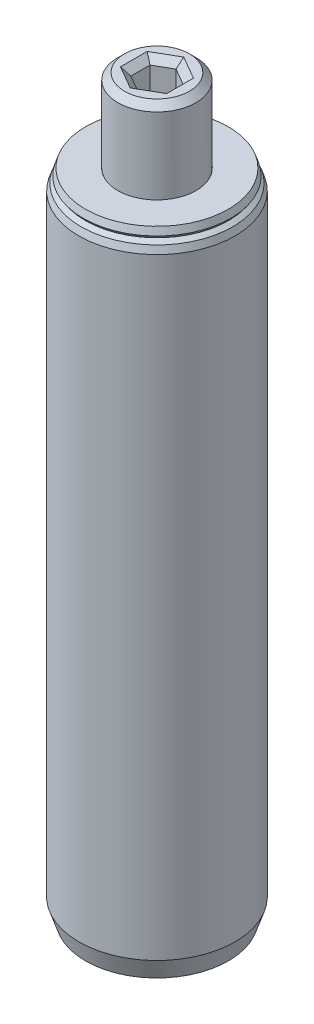
ISO-10303-21;
HEADER;
FILE_DESCRIPTION(('STEP AP214'),'2;1');
FILE_NAME('part.step','',(''),(''),'','','');
FILE_SCHEMA(('AUTOMOTIVE_DESIGN { 1 0 10303 214 1 1 1 1 }'));
ENDSEC;
DATA;
#1=APPLICATION_CONTEXT('core data for automotive mechanical design processes');
#2=APPLICATION_PROTOCOL_DEFINITION('international standard','automotive_design',2000,#1);
#3=PRODUCT_CONTEXT('',#1,'mechanical');
#4=PRODUCT('Part','Part','',(#3));
#5=PRODUCT_RELATED_PRODUCT_CATEGORY('part','',(#4));
#6=PRODUCT_DEFINITION_FORMATION('','',#4);
#7=PRODUCT_DEFINITION_CONTEXT('part definition',#1,'design');
#8=PRODUCT_DEFINITION('design','',#6,#7);
#9=PRODUCT_DEFINITION_SHAPE('','',#8);
#10=(LENGTH_UNIT() NAMED_UNIT(*) SI_UNIT(.MILLI.,.METRE.));
#11=(NAMED_UNIT(*) PLANE_ANGLE_UNIT() SI_UNIT($,.RADIAN.));
#12=(NAMED_UNIT(*) SI_UNIT($,.STERADIAN.) SOLID_ANGLE_UNIT());
#13=UNCERTAINTY_MEASURE_WITH_UNIT(LENGTH_MEASURE(1.E-05),#10,'distance_accuracy_value','');
#14=(GEOMETRIC_REPRESENTATION_CONTEXT(3) GLOBAL_UNCERTAINTY_ASSIGNED_CONTEXT((#13)) GLOBAL_UNIT_ASSIGNED_CONTEXT((#10,
#11,#12)) REPRESENTATION_CONTEXT('',''));
#15=CARTESIAN_POINT('',(0.,0.,0.));
#16=DIRECTION('',(0.,0.,1.));
#17=DIRECTION('',(1.,0.,0.));
#18=AXIS2_PLACEMENT_3D('',#15,#16,#17);
#19=CARTESIAN_POINT('',(0.,24.9936,0.));
#20=DIRECTION('',(0.,-1.,0.));
#21=DIRECTION('',(0.,0.,-1.));
#22=AXIS2_PLACEMENT_3D('',#19,#20,#21);
#23=PLANE('',#22);
#24=CARTESIAN_POINT('',(0.,24.9936,0.));
#25=DIRECTION('',(0.,-1.,0.));
#26=DIRECTION('',(0.,0.,-1.));
#27=AXIS2_PLACEMENT_3D('',#24,#25,#26);
#28=CIRCLE('',#27,1.504);
#29=CARTESIAN_POINT('',(0.,24.9936,-1.504));
#30=VERTEX_POINT('',#29);
#31=EDGE_CURVE('P0_E11',#30,#30,#28,.T.);
#32=ORIENTED_EDGE('',*,*,#31,.T.);
#33=EDGE_LOOP('',(#32));
#34=FACE_BOUND('',#33,.T.);
#35=CARTESIAN_POINT('',(0.,24.9936,0.));
#36=DIRECTION('',(0.,1.,0.));
#37=DIRECTION('',(0.,0.,1.));
#38=AXIS2_PLACEMENT_3D('',#35,#36,#37);
#39=CIRCLE('',#38,2.74319999999999);
#40=CARTESIAN_POINT('',(0.,24.9936,2.74319999999999));
#41=VERTEX_POINT('',#40);
#42=EDGE_CURVE('P0_E63',#41,#41,#39,.T.);
#43=ORIENTED_EDGE('',*,*,#42,.T.);
#44=EDGE_LOOP('',(#43));
#45=FACE_BOUND('',#44,.T.);
#46=ADVANCED_FACE('P0_F16',(#34,#45),#23,.F.);
#47=CARTESIAN_POINT('',(0.,24.7330827788524,0.));
#48=DIRECTION('',(0.,-1.,0.));
#49=DIRECTION('',(0.,0.,-1.));
#50=AXIS2_PLACEMENT_3D('',#47,#48,#49);
#51=CONICAL_SURFACE('',#50,2.83003907371585,0.321750554396636);
#52=ORIENTED_EDGE('',*,*,#42,.F.);
#53=EDGE_LOOP('',(#52));
#54=FACE_BOUND('',#53,.T.);
#55=CARTESIAN_POINT('',(0.,24.7330827788524,0.));
#56=DIRECTION('',(0.,1.,0.));
#57=DIRECTION('',(0.,0.,1.));
#58=AXIS2_PLACEMENT_3D('',#55,#56,#57);
#59=CIRCLE('',#58,2.83003907371585);
#60=CARTESIAN_POINT('',(0.,24.7330827788524,2.83003907371585));
#61=VERTEX_POINT('',#60);
#62=EDGE_CURVE('P0_E60',#61,#61,#59,.T.);
#63=ORIENTED_EDGE('',*,*,#62,.T.);
#64=EDGE_LOOP('',(#63));
#65=FACE_BOUND('',#64,.T.);
#66=ADVANCED_FACE('P0_F84',(#54,#65),#51,.T.);
#67=CARTESIAN_POINT('',(0.,24.6126,0.));
#68=DIRECTION('',(0.,1.,0.));
#69=DIRECTION('',(0.,0.,1.));
#70=AXIS2_PLACEMENT_3D('',#67,#68,#69);
#71=CONICAL_SURFACE('',#70,2.74319999999999,0.624522886199122);
#72=ORIENTED_EDGE('',*,*,#62,.F.);
#73=EDGE_LOOP('',(#72));
#74=FACE_BOUND('',#73,.T.);
#75=CARTESIAN_POINT('',(0.,24.6126,0.));
#76=DIRECTION('',(0.,1.,0.));
#77=DIRECTION('',(0.,0.,1.));
#78=AXIS2_PLACEMENT_3D('',#75,#76,#77);
#79=CIRCLE('',#78,2.74319999999999);
#80=CARTESIAN_POINT('',(0.,24.6126,2.74319999999999));
#81=VERTEX_POINT('',#80);
#82=EDGE_CURVE('P0_E57',#81,#81,#79,.T.);
#83=ORIENTED_EDGE('',*,*,#82,.T.);
#84=EDGE_LOOP('',(#83));
#85=FACE_BOUND('',#84,.T.);
#86=ADVANCED_FACE('P0_F90',(#74,#85),#71,.T.);
#87=CARTESIAN_POINT('',(0.,24.4921172211476,0.));
#88=DIRECTION('',(0.,-1.,0.));
#89=DIRECTION('',(0.,0.,-1.));
#90=AXIS2_PLACEMENT_3D('',#87,#88,#89);
#91=CONICAL_SURFACE('',#90,2.91036092628413,0.946273440595771);
#92=ORIENTED_EDGE('',*,*,#82,.F.);
#93=EDGE_LOOP('',(#92));
#94=FACE_BOUND('',#93,.T.);
#95=CARTESIAN_POINT('',(0.,24.4921172211476,0.));
#96=DIRECTION('',(0.,1.,0.));
#97=DIRECTION('',(0.,0.,1.));
#98=AXIS2_PLACEMENT_3D('',#95,#96,#97);
#99=CIRCLE('',#98,2.91036092628413);
#100=CARTESIAN_POINT('',(0.,24.4921172211476,2.91036092628413));
#101=VERTEX_POINT('',#100);
#102=EDGE_CURVE('P0_E54',#101,#101,#99,.T.);
#103=ORIENTED_EDGE('',*,*,#102,.T.);
#104=EDGE_LOOP('',(#103));
#105=FACE_BOUND('',#104,.T.);
#106=ADVANCED_FACE('P0_F97',(#94,#105),#91,.T.);
#107=CARTESIAN_POINT('',(0.,24.2316,0.));
#108=DIRECTION('',(0.,-1.,0.));
#109=DIRECTION('',(0.,0.,-1.));
#110=AXIS2_PLACEMENT_3D('',#107,#108,#109);
#111=CONICAL_SURFACE('',#110,2.99719999999999,0.321750554396653);
#112=ORIENTED_EDGE('',*,*,#102,.F.);
#113=EDGE_LOOP('',(#112));
#114=FACE_BOUND('',#113,.T.);
#115=CARTESIAN_POINT('',(0.,24.2316,0.));
#116=DIRECTION('',(0.,1.,0.));
#117=DIRECTION('',(0.,0.,1.));
#118=AXIS2_PLACEMENT_3D('',#115,#116,#117);
#119=CIRCLE('',#118,2.99719999999999);
#120=CARTESIAN_POINT('',(0.,24.2316,2.99719999999999));
#121=VERTEX_POINT('',#120);
#122=EDGE_CURVE('P0_E51',#121,#121,#119,.T.);
#123=ORIENTED_EDGE('',*,*,#122,.T.);
#124=EDGE_LOOP('',(#123));
#125=FACE_BOUND('',#124,.T.);
#126=ADVANCED_FACE('P0_F101',(#114,#125),#111,.T.);
#127=CARTESIAN_POINT('',(0.,24.9936,0.));
#128=DIRECTION('',(0.,1.,0.));
#129=DIRECTION('',(0.,0.,1.));
#130=AXIS2_PLACEMENT_3D('',#127,#128,#129);
#131=CYLINDRICAL_SURFACE('',#130,2.99719999999999);
#132=ORIENTED_EDGE('',*,*,#122,.F.);
#133=EDGE_LOOP('',(#132));
#134=FACE_BOUND('',#133,.T.);
#135=CARTESIAN_POINT('',(0.,0.762000000000002,0.));
#136=DIRECTION('',(0.,1.,0.));
#137=DIRECTION('',(0.,0.,1.));
#138=AXIS2_PLACEMENT_3D('',#135,#136,#137);
#139=CIRCLE('',#138,2.99719999999999);
#140=CARTESIAN_POINT('',(0.,0.762000000000002,2.99719999999999));
#141=VERTEX_POINT('',#140);
#142=EDGE_CURVE('P0_E48',#141,#141,#139,.T.);
#143=ORIENTED_EDGE('',*,*,#142,.T.);
#144=EDGE_LOOP('',(#143));
#145=FACE_BOUND('',#144,.T.);
#146=ADVANCED_FACE('P0_F105',(#134,#145),#131,.T.);
#147=CARTESIAN_POINT('',(0.,0.,0.));
#148=DIRECTION('',(0.,1.,0.));
#149=DIRECTION('',(0.,0.,1.));
#150=AXIS2_PLACEMENT_3D('',#147,#148,#149);
#151=CONICAL_SURFACE('',#150,2.74319999999999,0.321750554396643);
#152=ORIENTED_EDGE('',*,*,#142,.F.);
#153=EDGE_LOOP('',(#152));
#154=FACE_BOUND('',#153,.T.);
#155=CARTESIAN_POINT('',(0.,0.,0.));
#156=DIRECTION('',(0.,1.,0.));
#157=DIRECTION('',(0.,0.,1.));
#158=AXIS2_PLACEMENT_3D('',#155,#156,#157);
#159=CIRCLE('',#158,2.74319999999999);
#160=CARTESIAN_POINT('',(0.,0.,2.74319999999999));
#161=VERTEX_POINT('',#160);
#162=EDGE_CURVE('P0_E43',#161,#161,#159,.T.);
#163=ORIENTED_EDGE('',*,*,#162,.T.);
#164=EDGE_LOOP('',(#163));
#165=FACE_BOUND('',#164,.T.);
#166=ADVANCED_FACE('P0_F109',(#154,#165),#151,.T.);
#167=CARTESIAN_POINT('',(2.74319999999999,0.,0.));
#168=DIRECTION('',(0.,1.,0.));
#169=DIRECTION('',(0.,0.,1.));
#170=AXIS2_PLACEMENT_3D('',#167,#168,#169);
#171=PLANE('',#170);
#172=CARTESIAN_POINT('',(0.,0.,0.));
#173=DIRECTION('',(0.,1.,0.));
#174=DIRECTION('',(0.,0.,1.));
#175=AXIS2_PLACEMENT_3D('',#172,#173,#174);
#176=CIRCLE('',#175,1.504);
#177=CARTESIAN_POINT('',(0.,0.,1.504));
#178=VERTEX_POINT('',#177);
#179=EDGE_CURVE('P0_E69',#178,#178,#176,.T.);
#180=ORIENTED_EDGE('',*,*,#179,.T.);
#181=EDGE_LOOP('',(#180));
#182=FACE_BOUND('',#181,.T.);
#183=ORIENTED_EDGE('',*,*,#162,.F.);
#184=EDGE_LOOP('',(#183));
#185=FACE_BOUND('',#184,.T.);
#186=ADVANCED_FACE('P0_F113',(#182,#185),#171,.F.);
#187=CARTESIAN_POINT('',(0.,0.,0.));
#188=DIRECTION('',(0.,-1.,0.));
#189=DIRECTION('',(0.,0.,-1.));
#190=AXIS2_PLACEMENT_3D('',#187,#188,#189);
#191=CYLINDRICAL_SURFACE('',#190,1.25);
#192=CARTESIAN_POINT('',(0.,0.439940905122491,0.));
#193=DIRECTION('',(0.,1.,0.));
#194=DIRECTION('',(0.,0.,1.));
#195=AXIS2_PLACEMENT_3D('',#192,#193,#194);
#196=CIRCLE('',#195,1.25);
#197=CARTESIAN_POINT('',(0.,0.439940905122491,1.25));
#198=VERTEX_POINT('',#197);
#199=EDGE_CURVE('P0_E66',#198,#198,#196,.F.);
#200=ORIENTED_EDGE('',*,*,#199,.T.);
#201=EDGE_LOOP('',(#200));
#202=FACE_BOUND('',#201,.T.);
#203=CARTESIAN_POINT('',(0.,5.08,0.));
#204=DIRECTION('',(0.,-1.,0.));
#205=DIRECTION('',(0.,0.,-1.));
#206=AXIS2_PLACEMENT_3D('',#203,#204,#205);
#207=CIRCLE('',#206,1.25);
#208=CARTESIAN_POINT('',(0.,5.08,-1.25));
#209=VERTEX_POINT('',#208);
#210=EDGE_CURVE('P0_E40',#209,#209,#207,.T.);
#211=ORIENTED_EDGE('',*,*,#210,.F.);
#212=EDGE_LOOP('',(#211));
#213=FACE_BOUND('',#212,.T.);
#214=ADVANCED_FACE('P0_F117',(#202,#213),#191,.F.);
#215=CARTESIAN_POINT('',(0.,5.08,0.));
#216=DIRECTION('',(0.,-1.,0.));
#217=DIRECTION('',(0.,0.,-1.));
#218=AXIS2_PLACEMENT_3D('',#215,#216,#217);
#219=CONICAL_SURFACE('',#218,1.25,1.02974425867665);
#220=CARTESIAN_POINT('',(0.,5.83107577378445,0.));
#221=VERTEX_POINT('',#220);
#222=VERTEX_LOOP('',#221);
#223=FACE_BOUND('',#222,.T.);
#224=ORIENTED_EDGE('',*,*,#210,.T.);
#225=EDGE_LOOP('',(#224));
#226=FACE_BOUND('',#225,.T.);
#227=ADVANCED_FACE('P0_F121',(#223,#226),#219,.F.);
#228=CARTESIAN_POINT('',(0.,24.9936,0.));
#229=DIRECTION('',(0.,1.,0.));
#230=DIRECTION('',(0.,0.,1.));
#231=AXIS2_PLACEMENT_3D('',#228,#229,#230);
#232=CYLINDRICAL_SURFACE('',#231,1.25);
#233=CARTESIAN_POINT('',(0.,24.5536590948775,0.));
#234=DIRECTION('',(0.,-1.,0.));
#235=DIRECTION('',(0.,0.,-1.));
#236=AXIS2_PLACEMENT_3D('',#233,#234,#235);
#237=CIRCLE('',#236,1.25);
#238=CARTESIAN_POINT('',(0.,24.5536590948775,-1.25));
#239=VERTEX_POINT('',#238);
#240=EDGE_CURVE('P0_E24',#239,#239,#237,.F.);
#241=ORIENTED_EDGE('',*,*,#240,.T.);
#242=EDGE_LOOP('',(#241));
#243=FACE_BOUND('',#242,.T.);
#244=CARTESIAN_POINT('',(0.,19.9136,0.));
#245=DIRECTION('',(0.,1.,0.));
#246=DIRECTION('',(0.,0.,1.));
#247=AXIS2_PLACEMENT_3D('',#244,#245,#246);
#248=CIRCLE('',#247,1.25);
#249=CARTESIAN_POINT('',(0.,19.9136,1.25));
#250=VERTEX_POINT('',#249);
#251=EDGE_CURVE('P0_E38',#250,#250,#248,.T.);
#252=ORIENTED_EDGE('',*,*,#251,.F.);
#253=EDGE_LOOP('',(#252));
#254=FACE_BOUND('',#253,.T.);
#255=ADVANCED_FACE('P0_F34',(#243,#254),#232,.F.);
#256=CARTESIAN_POINT('',(0.,19.9136,0.));
#257=DIRECTION('',(0.,1.,0.));
#258=DIRECTION('',(0.,0.,1.));
#259=AXIS2_PLACEMENT_3D('',#256,#257,#258);
#260=CONICAL_SURFACE('',#259,1.25,1.02974425867665);
#261=CARTESIAN_POINT('',(0.,19.1625242262155,0.));
#262=VERTEX_POINT('',#261);
#263=VERTEX_LOOP('',#262);
#264=FACE_BOUND('',#263,.T.);
#265=ORIENTED_EDGE('',*,*,#251,.T.);
#266=EDGE_LOOP('',(#265));
#267=FACE_BOUND('',#266,.T.);
#268=ADVANCED_FACE('P0_F30',(#264,#267),#260,.F.);
#269=CARTESIAN_POINT('',(0.,0.439940905122491,0.));
#270=DIRECTION('',(0.,-1.,0.));
#271=DIRECTION('',(0.,0.,-1.));
#272=AXIS2_PLACEMENT_3D('',#269,#270,#271);
#273=CONICAL_SURFACE('',#272,1.25,0.523598775598305);
#274=ORIENTED_EDGE('',*,*,#179,.F.);
#275=EDGE_LOOP('',(#274));
#276=FACE_BOUND('',#275,.T.);
#277=ORIENTED_EDGE('',*,*,#199,.F.);
#278=EDGE_LOOP('',(#277));
#279=FACE_BOUND('',#278,.T.);
#280=ADVANCED_FACE('P0_F33',(#276,#279),#273,.F.);
#281=CARTESIAN_POINT('',(0.,24.5536590948775,0.));
#282=DIRECTION('',(0.,1.,0.));
#283=DIRECTION('',(0.,0.,1.));
#284=AXIS2_PLACEMENT_3D('',#281,#282,#283);
#285=CONICAL_SURFACE('',#284,1.25,0.523598775598305);
#286=ORIENTED_EDGE('',*,*,#31,.F.);
#287=EDGE_LOOP('',(#286));
#288=FACE_BOUND('',#287,.T.);
#289=ORIENTED_EDGE('',*,*,#240,.F.);
#290=EDGE_LOOP('',(#289));
#291=FACE_BOUND('',#290,.T.);
#292=ADVANCED_FACE('P0_F18',(#288,#291),#285,.F.);
#293=CLOSED_SHELL('',(#46,#66,#86,#106,#126,#146,#166,#186,#214,#227,#255,#268,#280,#292));
#294=MANIFOLD_SOLID_BREP('P0_B1',#293);
#295=CARTESIAN_POINT('',(-1.29903810567666,20.1686,0.749999999999999));
#296=DIRECTION('',(0.,1.,0.));
#297=DIRECTION('',(0.5,0.,0.866025403784439));
#298=AXIS2_PLACEMENT_3D('',#295,#296,#297);
#299=PLANE('',#298);
#300=CARTESIAN_POINT('',(0.,20.1686,0.));
#301=DIRECTION('',(0.,1.,0.));
#302=DIRECTION('',(0.5,0.,0.866025403784439));
#303=AXIS2_PLACEMENT_3D('',#300,#301,#302);
#304=CIRCLE('',#303,1.246);
#305=CARTESIAN_POINT('',(0.623,20.1686,1.07906765311541));
#306=VERTEX_POINT('',#305);
#307=EDGE_CURVE('P1_E126',#306,#306,#304,.F.);
#308=ORIENTED_EDGE('',*,*,#307,.T.);
#309=EDGE_LOOP('',(#308));
#310=FACE_BOUND('',#309,.T.);
#311=ADVANCED_FACE('P1_F16',(#310),#299,.F.);
#312=CARTESIAN_POINT('',(0.,28.1686,0.));
#313=DIRECTION('',(0.,-1.,0.));
#314=DIRECTION('',(-0.5,0.,-0.866025403784439));
#315=AXIS2_PLACEMENT_3D('',#312,#313,#314);
#316=PLANE('',#315);
#317=DIRECTION('',(0.866025403784439,0.,0.5));
#318=VECTOR('',#317,1.);
#319=CARTESIAN_POINT('',(0.444500000000001,28.1686,-0.769896583964367));
#320=LINE('',#319,#318);
#321=CARTESIAN_POINT('',(0.,28.1686,-1.02652877861916));
#322=VERTEX_POINT('',#321);
#323=CARTESIAN_POINT('',(0.889000000000001,28.1686,-0.513264389309577));
#324=VERTEX_POINT('',#323);
#325=EDGE_CURVE('P1_E157',#322,#324,#320,.T.);
#326=ORIENTED_EDGE('',*,*,#325,.T.);
#327=DIRECTION('',(0.,0.,1.));
#328=VECTOR('',#327,1.);
#329=CARTESIAN_POINT('',(0.889000000000001,28.1686,0.));
#330=LINE('',#329,#328);
#331=CARTESIAN_POINT('',(0.889000000000001,28.1686,0.513264389309578));
#332=VERTEX_POINT('',#331);
#333=EDGE_CURVE('P1_E159',#324,#332,#330,.T.);
#334=ORIENTED_EDGE('',*,*,#333,.T.);
#335=DIRECTION('',(-0.866025403784439,0.,0.5));
#336=VECTOR('',#335,1.);
#337=CARTESIAN_POINT('',(0.4445,28.1686,0.769896583964367));
#338=LINE('',#337,#336);
#339=CARTESIAN_POINT('',(0.,28.1686,1.02652877861916));
#340=VERTEX_POINT('',#339);
#341=EDGE_CURVE('P1_E149',#332,#340,#338,.T.);
#342=ORIENTED_EDGE('',*,*,#341,.T.);
#343=DIRECTION('',(-0.866025403784439,0.,-0.5));
#344=VECTOR('',#343,1.);
#345=CARTESIAN_POINT('',(-0.444500000000001,28.1686,0.769896583964367));
#346=LINE('',#345,#344);
#347=CARTESIAN_POINT('',(-0.889000000000001,28.1686,0.513264389309578));
#348=VERTEX_POINT('',#347);
#349=EDGE_CURVE('P1_E151',#340,#348,#346,.T.);
#350=ORIENTED_EDGE('',*,*,#349,.T.);
#351=DIRECTION('',(0.,0.,-1.));
#352=VECTOR('',#351,1.);
#353=CARTESIAN_POINT('',(-0.889000000000001,28.1686,0.));
#354=LINE('',#353,#352);
#355=CARTESIAN_POINT('',(-0.889000000000001,28.1686,-0.513264389309578));
#356=VERTEX_POINT('',#355);
#357=EDGE_CURVE('P1_E153',#348,#356,#354,.T.);
#358=ORIENTED_EDGE('',*,*,#357,.T.);
#359=DIRECTION('',(0.866025403784439,0.,-0.499999999999999));
#360=VECTOR('',#359,1.);
#361=CARTESIAN_POINT('',(-0.4445,28.1686,-0.769896583964367));
#362=LINE('',#361,#360);
#363=EDGE_CURVE('P1_E155',#356,#322,#362,.T.);
#364=ORIENTED_EDGE('',*,*,#363,.T.);
#365=EDGE_LOOP('',(#326,#334,#342,#350,#358,#364));
#366=FACE_BOUND('',#365,.T.);
#367=CARTESIAN_POINT('',(0.,28.1686,0.));
#368=DIRECTION('',(0.,-1.,0.));
#369=DIRECTION('',(-0.5,0.,-0.866025403784439));
#370=AXIS2_PLACEMENT_3D('',#367,#368,#369);
#371=CIRCLE('',#370,1.246);
#372=CARTESIAN_POINT('',(-0.623,28.1686,-1.07906765311541));
#373=VERTEX_POINT('',#372);
#374=EDGE_CURVE('P1_E143',#373,#373,#371,.F.);
#375=ORIENTED_EDGE('',*,*,#374,.T.);
#376=EDGE_LOOP('',(#375));
#377=FACE_BOUND('',#376,.T.);
#378=ADVANCED_FACE('P1_F208',(#366,#377),#316,.F.);
#379=CARTESIAN_POINT('',(0.,20.1686,0.));
#380=DIRECTION('',(0.,-1.,0.));
#381=DIRECTION('',(-0.5,0.,-0.866025403784439));
#382=AXIS2_PLACEMENT_3D('',#379,#380,#381);
#383=CYLINDRICAL_SURFACE('',#382,1.5);
#384=CARTESIAN_POINT('',(0.,20.4226,0.));
#385=DIRECTION('',(0.,1.,0.));
#386=DIRECTION('',(0.5,0.,0.866025403784439));
#387=AXIS2_PLACEMENT_3D('',#384,#385,#386);
#388=CIRCLE('',#387,1.5);
#389=CARTESIAN_POINT('',(0.749999999999999,20.4226,1.29903810567666));
#390=VERTEX_POINT('',#389);
#391=EDGE_CURVE('P1_E140',#390,#390,#388,.T.);
#392=ORIENTED_EDGE('',*,*,#391,.T.);
#393=EDGE_LOOP('',(#392));
#394=FACE_BOUND('',#393,.T.);
#395=CARTESIAN_POINT('',(0.,27.9146,0.));
#396=DIRECTION('',(0.,-1.,0.));
#397=DIRECTION('',(-0.5,0.,-0.866025403784439));
#398=AXIS2_PLACEMENT_3D('',#395,#396,#397);
#399=CIRCLE('',#398,1.5);
#400=CARTESIAN_POINT('',(-0.749999999999999,27.9146,-1.29903810567666));
#401=VERTEX_POINT('',#400);
#402=EDGE_CURVE('P1_E137',#401,#401,#399,.T.);
#403=ORIENTED_EDGE('',*,*,#402,.T.);
#404=EDGE_LOOP('',(#403));
#405=FACE_BOUND('',#404,.T.);
#406=ADVANCED_FACE('P1_F211',(#394,#405),#383,.T.);
#407=CARTESIAN_POINT('',(0.,20.1686,0.));
#408=DIRECTION('',(0.,1.,0.));
#409=DIRECTION('',(0.5,0.,0.866025403784439));
#410=AXIS2_PLACEMENT_3D('',#407,#408,#409);
#411=CONICAL_SURFACE('',#410,1.246,0.785398163397446);
#412=ORIENTED_EDGE('',*,*,#391,.F.);
#413=EDGE_LOOP('',(#412));
#414=FACE_BOUND('',#413,.T.);
#415=ORIENTED_EDGE('',*,*,#307,.F.);
#416=EDGE_LOOP('',(#415));
#417=FACE_BOUND('',#416,.T.);
#418=ADVANCED_FACE('P1_F218',(#414,#417),#411,.T.);
#419=CARTESIAN_POINT('',(0.,27.9146,0.));
#420=DIRECTION('',(0.,-1.,0.));
#421=DIRECTION('',(-0.5,0.,-0.866025403784439));
#422=AXIS2_PLACEMENT_3D('',#419,#420,#421);
#423=CONICAL_SURFACE('',#422,1.5,0.785398163397447);
#424=ORIENTED_EDGE('',*,*,#374,.F.);
#425=EDGE_LOOP('',(#424));
#426=FACE_BOUND('',#425,.T.);
#427=ORIENTED_EDGE('',*,*,#402,.F.);
#428=EDGE_LOOP('',(#427));
#429=FACE_BOUND('',#428,.T.);
#430=ADVANCED_FACE('P1_F215',(#426,#429),#423,.T.);
#431=CARTESIAN_POINT('',(0.635,26.8986,-0.366617420935412));
#432=DIRECTION('',(0.5,0.,-0.866025403784438));
#433=DIRECTION('',(-0.866025403784439,0.,-0.5));
#434=AXIS2_PLACEMENT_3D('',#431,#432,#433);
#435=PLANE('',#434);
#436=DIRECTION('',(0.,1.,0.));
#437=VECTOR('',#436,1.);
#438=CARTESIAN_POINT('',(0.635,26.8986,-0.366617420935412));
#439=LINE('',#438,#437);
#440=CARTESIAN_POINT('',(0.635,26.8986,-0.366617420935412));
#441=VERTEX_POINT('',#440);
#442=CARTESIAN_POINT('',(0.635,27.9146,-0.366617420935412));
#443=VERTEX_POINT('',#442);
#444=EDGE_CURVE('P1_E124',#441,#443,#439,.T.);
#445=ORIENTED_EDGE('',*,*,#444,.T.);
#446=DIRECTION('',(-0.866025403784439,0.,-0.5));
#447=VECTOR('',#446,1.);
#448=CARTESIAN_POINT('',(0.635,27.9146,-0.366617420935412));
#449=LINE('',#448,#447);
#450=CARTESIAN_POINT('',(0.,27.9146,-0.733234841870825));
#451=VERTEX_POINT('',#450);
#452=EDGE_CURVE('P1_E96',#443,#451,#449,.T.);
#453=ORIENTED_EDGE('',*,*,#452,.T.);
#454=DIRECTION('',(0.,1.,0.));
#455=VECTOR('',#454,1.);
#456=CARTESIAN_POINT('',(0.,26.8986,-0.733234841870825));
#457=LINE('',#456,#455);
#458=CARTESIAN_POINT('',(0.,26.8986,-0.733234841870825));
#459=VERTEX_POINT('',#458);
#460=EDGE_CURVE('P1_E88',#459,#451,#457,.T.);
#461=ORIENTED_EDGE('',*,*,#460,.F.);
#462=DIRECTION('',(-0.866025403784439,0.,-0.5));
#463=VECTOR('',#462,1.);
#464=CARTESIAN_POINT('',(0.635,26.8986,-0.366617420935412));
#465=LINE('',#464,#463);
#466=EDGE_CURVE('P1_E93',#441,#459,#465,.T.);
#467=ORIENTED_EDGE('',*,*,#466,.F.);
#468=EDGE_LOOP('',(#445,#453,#461,#467));
#469=FACE_BOUND('',#468,.T.);
#470=ADVANCED_FACE('P1_F91',(#469),#435,.F.);
#471=CARTESIAN_POINT('',(0.635,26.8986,0.366617420935413));
#472=DIRECTION('',(1.,0.,0.));
#473=DIRECTION('',(0.,0.,-1.));
#474=AXIS2_PLACEMENT_3D('',#471,#472,#473);
#475=PLANE('',#474);
#476=DIRECTION('',(0.,1.,0.));
#477=VECTOR('',#476,1.);
#478=CARTESIAN_POINT('',(0.635,26.8986,0.366617420935413));
#479=LINE('',#478,#477);
#480=CARTESIAN_POINT('',(0.635,26.8986,0.366617420935413));
#481=VERTEX_POINT('',#480);
#482=CARTESIAN_POINT('',(0.635,27.9146,0.366617420935413));
#483=VERTEX_POINT('',#482);
#484=EDGE_CURVE('P1_E127',#481,#483,#479,.T.);
#485=ORIENTED_EDGE('',*,*,#484,.T.);
#486=DIRECTION('',(0.,0.,-1.));
#487=VECTOR('',#486,1.);
#488=CARTESIAN_POINT('',(0.635,27.9146,0.366617420935413));
#489=LINE('',#488,#487);
#490=EDGE_CURVE('P1_E146',#483,#443,#489,.T.);
#491=ORIENTED_EDGE('',*,*,#490,.T.);
#492=ORIENTED_EDGE('',*,*,#444,.F.);
#493=DIRECTION('',(0.,0.,-1.));
#494=VECTOR('',#493,1.);
#495=CARTESIAN_POINT('',(0.635,26.8986,0.366617420935413));
#496=LINE('',#495,#494);
#497=EDGE_CURVE('P1_E100',#481,#441,#496,.T.);
#498=ORIENTED_EDGE('',*,*,#497,.F.);
#499=EDGE_LOOP('',(#485,#491,#492,#498));
#500=FACE_BOUND('',#499,.T.);
#501=ADVANCED_FACE('P1_F199',(#500),#475,.F.);
#502=CARTESIAN_POINT('',(0.,26.8986,0.733234841870825));
#503=DIRECTION('',(0.5,0.,0.866025403784439));
#504=DIRECTION('',(0.866025403784439,0.,-0.5));
#505=AXIS2_PLACEMENT_3D('',#502,#503,#504);
#506=PLANE('',#505);
#507=DIRECTION('',(0.,1.,0.));
#508=VECTOR('',#507,1.);
#509=CARTESIAN_POINT('',(0.,26.8986,0.733234841870825));
#510=LINE('',#509,#508);
#511=CARTESIAN_POINT('',(0.,26.8986,0.733234841870825));
#512=VERTEX_POINT('',#511);
#513=CARTESIAN_POINT('',(0.,27.9146,0.733234841870825));
#514=VERTEX_POINT('',#513);
#515=EDGE_CURVE('P1_E130',#512,#514,#510,.T.);
#516=ORIENTED_EDGE('',*,*,#515,.T.);
#517=DIRECTION('',(0.866025403784439,0.,-0.5));
#518=VECTOR('',#517,1.);
#519=CARTESIAN_POINT('',(0.,27.9146,0.733234841870825));
#520=LINE('',#519,#518);
#521=EDGE_CURVE('P1_E11',#514,#483,#520,.T.);
#522=ORIENTED_EDGE('',*,*,#521,.T.);
#523=ORIENTED_EDGE('',*,*,#484,.F.);
#524=DIRECTION('',(0.866025403784439,0.,-0.5));
#525=VECTOR('',#524,1.);
#526=CARTESIAN_POINT('',(0.,26.8986,0.733234841870825));
#527=LINE('',#526,#525);
#528=EDGE_CURVE('P1_E121',#512,#481,#527,.T.);
#529=ORIENTED_EDGE('',*,*,#528,.F.);
#530=EDGE_LOOP('',(#516,#522,#523,#529));
#531=FACE_BOUND('',#530,.T.);
#532=ADVANCED_FACE('P1_F196',(#531),#506,.F.);
#533=CARTESIAN_POINT('',(-0.635,26.8986,0.366617420935412));
#534=DIRECTION('',(-0.5,0.,0.866025403784438));
#535=DIRECTION('',(0.866025403784438,0.,0.5));
#536=AXIS2_PLACEMENT_3D('',#533,#534,#535);
#537=PLANE('',#536);
#538=DIRECTION('',(0.,1.,0.));
#539=VECTOR('',#538,1.);
#540=CARTESIAN_POINT('',(-0.635,26.8986,0.366617420935412));
#541=LINE('',#540,#539);
#542=CARTESIAN_POINT('',(-0.635,26.8986,0.366617420935412));
#543=VERTEX_POINT('',#542);
#544=CARTESIAN_POINT('',(-0.635,27.9146,0.366617420935412));
#545=VERTEX_POINT('',#544);
#546=EDGE_CURVE('P1_E132',#543,#545,#541,.T.);
#547=ORIENTED_EDGE('',*,*,#546,.T.);
#548=DIRECTION('',(0.866025403784438,0.,0.5));
#549=VECTOR('',#548,1.);
#550=CARTESIAN_POINT('',(-0.635,27.9146,0.366617420935412));
#551=LINE('',#550,#549);
#552=EDGE_CURVE('P1_E25',#545,#514,#551,.T.);
#553=ORIENTED_EDGE('',*,*,#552,.T.);
#554=ORIENTED_EDGE('',*,*,#515,.F.);
#555=DIRECTION('',(0.866025403784439,0.,0.5));
#556=VECTOR('',#555,1.);
#557=CARTESIAN_POINT('',(-0.635,26.8986,0.366617420935412));
#558=LINE('',#557,#556);
#559=EDGE_CURVE('P1_E118',#543,#512,#558,.T.);
#560=ORIENTED_EDGE('',*,*,#559,.F.);
#561=EDGE_LOOP('',(#547,#553,#554,#560));
#562=FACE_BOUND('',#561,.T.);
#563=ADVANCED_FACE('P1_F263',(#562),#537,.F.);
#564=CARTESIAN_POINT('',(-0.635,26.8986,-0.366617420935413));
#565=DIRECTION('',(-1.,0.,0.));
#566=DIRECTION('',(0.,0.,1.));
#567=AXIS2_PLACEMENT_3D('',#564,#565,#566);
#568=PLANE('',#567);
#569=DIRECTION('',(0.,1.,0.));
#570=VECTOR('',#569,1.);
#571=CARTESIAN_POINT('',(-0.635,26.8986,-0.366617420935413));
#572=LINE('',#571,#570);
#573=CARTESIAN_POINT('',(-0.635,26.8986,-0.366617420935413));
#574=VERTEX_POINT('',#573);
#575=CARTESIAN_POINT('',(-0.635,27.9146,-0.366617420935413));
#576=VERTEX_POINT('',#575);
#577=EDGE_CURVE('P1_E99',#574,#576,#572,.T.);
#578=ORIENTED_EDGE('',*,*,#577,.T.);
#579=DIRECTION('',(0.,0.,1.));
#580=VECTOR('',#579,1.);
#581=CARTESIAN_POINT('',(-0.635,27.9146,-0.366617420935413));
#582=LINE('',#581,#580);
#583=EDGE_CURVE('P1_E40',#576,#545,#582,.T.);
#584=ORIENTED_EDGE('',*,*,#583,.T.);
#585=ORIENTED_EDGE('',*,*,#546,.F.);
#586=DIRECTION('',(0.,0.,1.));
#587=VECTOR('',#586,1.);
#588=CARTESIAN_POINT('',(-0.635,26.8986,-0.366617420935413));
#589=LINE('',#588,#587);
#590=EDGE_CURVE('P1_E108',#574,#543,#589,.T.);
#591=ORIENTED_EDGE('',*,*,#590,.F.);
#592=EDGE_LOOP('',(#578,#584,#585,#591));
#593=FACE_BOUND('',#592,.T.);
#594=ADVANCED_FACE('P1_F256',(#593),#568,.F.);
#595=CARTESIAN_POINT('',(0.,26.8986,-0.733234841870825));
#596=DIRECTION('',(-0.499999999999999,0.,-0.866025403784439));
#597=DIRECTION('',(-0.866025403784439,0.,0.499999999999999));
#598=AXIS2_PLACEMENT_3D('',#595,#596,#597);
#599=PLANE('',#598);
#600=ORIENTED_EDGE('',*,*,#460,.T.);
#601=DIRECTION('',(-0.866025403784439,0.,0.499999999999999));
#602=VECTOR('',#601,1.);
#603=CARTESIAN_POINT('',(0.,27.9146,-0.733234841870825));
#604=LINE('',#603,#602);
#605=EDGE_CURVE('P1_E163',#451,#576,#604,.T.);
#606=ORIENTED_EDGE('',*,*,#605,.T.);
#607=ORIENTED_EDGE('',*,*,#577,.F.);
#608=DIRECTION('',(-0.866025403784439,0.,0.499999999999999));
#609=VECTOR('',#608,1.);
#610=CARTESIAN_POINT('',(0.,26.8986,-0.733234841870825));
#611=LINE('',#610,#609);
#612=EDGE_CURVE('P1_E103',#459,#574,#611,.T.);
#613=ORIENTED_EDGE('',*,*,#612,.F.);
#614=EDGE_LOOP('',(#600,#606,#607,#613));
#615=FACE_BOUND('',#614,.T.);
#616=ADVANCED_FACE('P1_F104',(#615),#599,.F.);
#617=CARTESIAN_POINT('',(1.27,26.8986,0.));
#618=DIRECTION('',(0.,-1.,0.));
#619=DIRECTION('',(-0.5,0.,-0.866025403784439));
#620=AXIS2_PLACEMENT_3D('',#617,#618,#619);
#621=PLANE('',#620);
#622=ORIENTED_EDGE('',*,*,#466,.T.);
#623=ORIENTED_EDGE('',*,*,#612,.T.);
#624=ORIENTED_EDGE('',*,*,#590,.T.);
#625=ORIENTED_EDGE('',*,*,#559,.T.);
#626=ORIENTED_EDGE('',*,*,#528,.T.);
#627=ORIENTED_EDGE('',*,*,#497,.T.);
#628=EDGE_LOOP('',(#622,#623,#624,#625,#626,#627));
#629=FACE_BOUND('',#628,.T.);
#630=ADVANCED_FACE('P1_F110',(#629),#621,.F.);
#631=CARTESIAN_POINT('',(-0.635,27.9146,-0.366617420935413));
#632=DIRECTION('',(-0.707106781186546,-0.707106781186549,0.));
#633=DIRECTION('',(0.654653670707978,-0.654653670707976,-0.377964473009228));
#634=AXIS2_PLACEMENT_3D('',#631,#632,#633);
#635=PLANE('',#634);
#636=DIRECTION('',(-0.654653670707978,0.654653670707976,-0.377964473009228));
#637=VECTOR('',#636,1.);
#638=CARTESIAN_POINT('',(-0.453571428571428,27.7331714285714,-0.261869586382437));
#639=LINE('',#638,#637);
#640=EDGE_CURVE('P1_E115',#356,#576,#639,.F.);
#641=ORIENTED_EDGE('',*,*,#640,.F.);
#642=ORIENTED_EDGE('',*,*,#357,.F.);
#643=DIRECTION('',(-0.654653670707979,0.654653670707976,0.377964473009227));
#644=VECTOR('',#643,1.);
#645=CARTESIAN_POINT('',(-0.453571428571428,27.7331714285714,0.261869586382437));
#646=LINE('',#645,#644);
#647=EDGE_CURVE('P1_E20',#545,#348,#646,.T.);
#648=ORIENTED_EDGE('',*,*,#647,.F.);
#649=ORIENTED_EDGE('',*,*,#583,.F.);
#650=EDGE_LOOP('',(#641,#642,#648,#649));
#651=FACE_BOUND('',#650,.T.);
#652=ADVANCED_FACE('P1_F18',(#651),#635,.F.);
#653=CARTESIAN_POINT('',(-0.635,27.9146,0.366617420935412));
#654=DIRECTION('',(-0.353553390593273,-0.707106781186549,0.612372435695793));
#655=DIRECTION('',(0.654653670707978,-0.654653670707976,-0.377964473009227));
#656=AXIS2_PLACEMENT_3D('',#653,#654,#655);
#657=PLANE('',#656);
#658=ORIENTED_EDGE('',*,*,#647,.T.);
#659=ORIENTED_EDGE('',*,*,#349,.F.);
#660=DIRECTION('',(0.,0.654653670707976,0.755928946018456));
#661=VECTOR('',#660,1.);
#662=CARTESIAN_POINT('',(0.,27.7331714285714,0.523739172764874));
#663=LINE('',#662,#661);
#664=EDGE_CURVE('P1_E174',#514,#340,#663,.T.);
#665=ORIENTED_EDGE('',*,*,#664,.F.);
#666=ORIENTED_EDGE('',*,*,#552,.F.);
#667=EDGE_LOOP('',(#658,#659,#665,#666));
#668=FACE_BOUND('',#667,.T.);
#669=ADVANCED_FACE('P1_F188',(#668),#657,.F.);
#670=CARTESIAN_POINT('',(0.,27.9146,-0.733234841870825));
#671=DIRECTION('',(-0.353553390593273,-0.707106781186549,-0.612372435695793));
#672=DIRECTION('',(-0.353553390593274,0.707106781186546,-0.612372435695796));
#673=AXIS2_PLACEMENT_3D('',#670,#671,#672);
#674=PLANE('',#673);
#675=ORIENTED_EDGE('',*,*,#640,.T.);
#676=ORIENTED_EDGE('',*,*,#605,.F.);
#677=DIRECTION('',(0.,0.654653670707976,-0.755928946018456));
#678=VECTOR('',#677,1.);
#679=CARTESIAN_POINT('',(0.,27.7331714285714,-0.523739172764874));
#680=LINE('',#679,#678);
#681=EDGE_CURVE('P1_E171',#322,#451,#680,.F.);
#682=ORIENTED_EDGE('',*,*,#681,.F.);
#683=ORIENTED_EDGE('',*,*,#363,.F.);
#684=EDGE_LOOP('',(#675,#676,#682,#683));
#685=FACE_BOUND('',#684,.T.);
#686=ADVANCED_FACE('P1_F180',(#685),#674,.F.);
#687=CARTESIAN_POINT('',(0.,27.9146,0.733234841870825));
#688=DIRECTION('',(0.353553390593273,-0.707106781186549,0.612372435695794));
#689=DIRECTION('',(-0.353553390593274,-0.707106781186546,-0.612372435695796));
#690=AXIS2_PLACEMENT_3D('',#687,#688,#689);
#691=PLANE('',#690);
#692=ORIENTED_EDGE('',*,*,#664,.T.);
#693=ORIENTED_EDGE('',*,*,#341,.F.);
#694=DIRECTION('',(-0.654653670707978,-0.654653670707976,-0.377964473009228));
#695=VECTOR('',#694,1.);
#696=CARTESIAN_POINT('',(0.635,27.9146,0.366617420935413));
#697=LINE('',#696,#695);
#698=EDGE_CURVE('P1_E169',#483,#332,#697,.F.);
#699=ORIENTED_EDGE('',*,*,#698,.F.);
#700=ORIENTED_EDGE('',*,*,#521,.F.);
#701=EDGE_LOOP('',(#692,#693,#699,#700));
#702=FACE_BOUND('',#701,.T.);
#703=ADVANCED_FACE('P1_F193',(#702),#691,.F.);
#704=CARTESIAN_POINT('',(0.635,27.9146,-0.366617420935412));
#705=DIRECTION('',(0.353553390593273,-0.707106781186549,-0.612372435695793));
#706=DIRECTION('',(0.654653670707978,0.654653670707976,-0.377964473009227));
#707=AXIS2_PLACEMENT_3D('',#704,#705,#706);
#708=PLANE('',#707);
#709=ORIENTED_EDGE('',*,*,#681,.T.);
#710=ORIENTED_EDGE('',*,*,#452,.F.);
#711=DIRECTION('',(0.654653670707979,0.654653670707976,-0.377964473009227));
#712=VECTOR('',#711,1.);
#713=CARTESIAN_POINT('',(0.453571428571428,27.7331714285714,-0.261869586382437));
#714=LINE('',#713,#712);
#715=EDGE_CURVE('P1_E167',#324,#443,#714,.F.);
#716=ORIENTED_EDGE('',*,*,#715,.F.);
#717=ORIENTED_EDGE('',*,*,#325,.F.);
#718=EDGE_LOOP('',(#709,#710,#716,#717));
#719=FACE_BOUND('',#718,.T.);
#720=ADVANCED_FACE('P1_F206',(#719),#708,.F.);
#721=CARTESIAN_POINT('',(0.635,27.9146,0.366617420935413));
#722=DIRECTION('',(0.707106781186546,-0.707106781186549,0.));
#723=DIRECTION('',(0.654653670707978,0.654653670707976,-0.377964473009228));
#724=AXIS2_PLACEMENT_3D('',#721,#722,#723);
#725=PLANE('',#724);
#726=ORIENTED_EDGE('',*,*,#698,.T.);
#727=ORIENTED_EDGE('',*,*,#333,.F.);
#728=ORIENTED_EDGE('',*,*,#715,.T.);
#729=ORIENTED_EDGE('',*,*,#490,.F.);
#730=EDGE_LOOP('',(#726,#727,#728,#729));
#731=FACE_BOUND('',#730,.T.);
#732=ADVANCED_FACE('P1_F201',(#731),#725,.F.);
#733=CLOSED_SHELL('',(#311,#378,#406,#418,#430,#470,#501,#532,#563,#594,#616,#630,#652,#669,
#686,#703,#720,#732));
#734=MANIFOLD_SOLID_BREP('P1_B1',#733);
#735=ADVANCED_BREP_SHAPE_REPRESENTATION('',(#18,#294,#734),#14);
#736=SHAPE_DEFINITION_REPRESENTATION(#9,#735);
ENDSEC;
END-ISO-10303-21;
